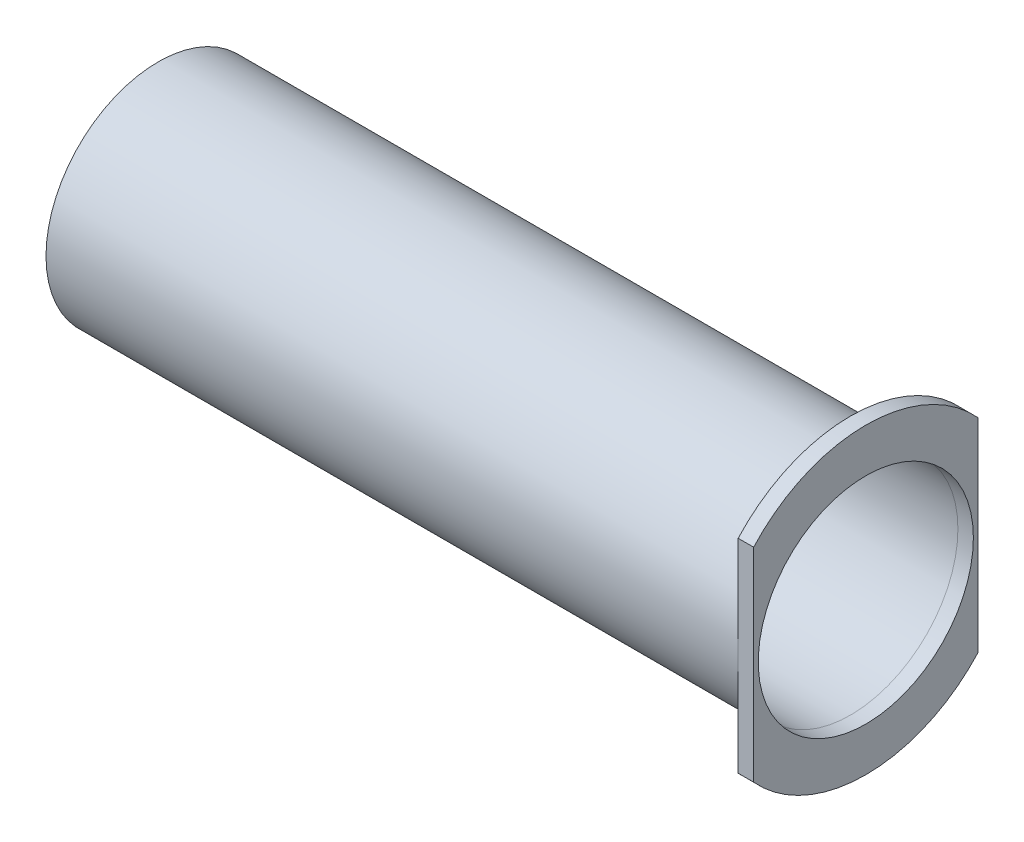
ISO-10303-21;
HEADER;
FILE_DESCRIPTION(('STEP AP214'),'2;1');
FILE_NAME('part.step','',(''),(''),'','','');
FILE_SCHEMA(('AUTOMOTIVE_DESIGN { 1 0 10303 214 1 1 1 1 }'));
ENDSEC;
DATA;
#1=APPLICATION_CONTEXT('core data for automotive mechanical design processes');
#2=APPLICATION_PROTOCOL_DEFINITION('international standard','automotive_design',2000,#1);
#3=PRODUCT_CONTEXT('',#1,'mechanical');
#4=PRODUCT('Part','Part','',(#3));
#5=PRODUCT_RELATED_PRODUCT_CATEGORY('part','',(#4));
#6=PRODUCT_DEFINITION_FORMATION('','',#4);
#7=PRODUCT_DEFINITION_CONTEXT('part definition',#1,'design');
#8=PRODUCT_DEFINITION('design','',#6,#7);
#9=PRODUCT_DEFINITION_SHAPE('','',#8);
#10=(LENGTH_UNIT() NAMED_UNIT(*) SI_UNIT(.MILLI.,.METRE.));
#11=(NAMED_UNIT(*) PLANE_ANGLE_UNIT() SI_UNIT($,.RADIAN.));
#12=(NAMED_UNIT(*) SI_UNIT($,.STERADIAN.) SOLID_ANGLE_UNIT());
#13=UNCERTAINTY_MEASURE_WITH_UNIT(LENGTH_MEASURE(1.E-05),#10,'distance_accuracy_value','');
#14=(GEOMETRIC_REPRESENTATION_CONTEXT(3) GLOBAL_UNCERTAINTY_ASSIGNED_CONTEXT((#13)) GLOBAL_UNIT_ASSIGNED_CONTEXT((#10,
#11,#12)) REPRESENTATION_CONTEXT('',''));
#15=CARTESIAN_POINT('',(0.,0.,0.));
#16=DIRECTION('',(0.,0.,1.));
#17=DIRECTION('',(1.,0.,0.));
#18=AXIS2_PLACEMENT_3D('',#15,#16,#17);
#19=CARTESIAN_POINT('',(79.4552631578947,0.,-24.31));
#20=DIRECTION('',(0.,0.,1.));
#21=DIRECTION('',(1.,0.,0.));
#22=AXIS2_PLACEMENT_3D('',#19,#20,#21);
#23=PLANE('',#22);
#24=DIRECTION('',(0.,1.,0.));
#25=VECTOR('',#24,1.);
#26=CARTESIAN_POINT('',(76.1052631578947,0.,-24.31));
#27=LINE('',#26,#25);
#28=CARTESIAN_POINT('',(76.1052631578947,-22.0494058876878,-24.31));
#29=VERTEX_POINT('',#28);
#30=CARTESIAN_POINT('',(76.1052631578947,22.0494058876878,-24.31));
#31=VERTEX_POINT('',#30);
#32=EDGE_CURVE('E118',#29,#31,#27,.T.);
#33=ORIENTED_EDGE('',*,*,#32,.T.);
#34=DIRECTION('',(-1.,0.,0.));
#35=VECTOR('',#34,1.);
#36=CARTESIAN_POINT('',(79.4552631578947,22.0494058876878,-24.31));
#37=LINE('',#36,#35);
#38=CARTESIAN_POINT('',(79.4552631578947,22.0494058876878,-24.31));
#39=VERTEX_POINT('',#38);
#40=EDGE_CURVE('E12',#39,#31,#37,.T.);
#41=ORIENTED_EDGE('',*,*,#40,.F.);
#42=DIRECTION('',(0.,1.,0.));
#43=VECTOR('',#42,1.);
#44=CARTESIAN_POINT('',(79.4552631578947,0.,-24.31));
#45=LINE('',#44,#43);
#46=CARTESIAN_POINT('',(79.4552631578947,-22.0494058876878,-24.31));
#47=VERTEX_POINT('',#46);
#48=EDGE_CURVE('E100',#47,#39,#45,.T.);
#49=ORIENTED_EDGE('',*,*,#48,.F.);
#50=DIRECTION('',(-1.,0.,0.));
#51=VECTOR('',#50,1.);
#52=CARTESIAN_POINT('',(79.4552631578947,-22.0494058876878,-24.31));
#53=LINE('',#52,#51);
#54=EDGE_CURVE('E117',#47,#29,#53,.T.);
#55=ORIENTED_EDGE('',*,*,#54,.T.);
#56=EDGE_LOOP('',(#33,#41,#49,#55));
#57=FACE_BOUND('',#56,.T.);
#58=ADVANCED_FACE('F52',(#57),#23,.F.);
#59=CARTESIAN_POINT('',(79.4552631578947,0.,0.));
#60=DIRECTION('',(-1.,0.,0.));
#61=DIRECTION('',(0.,0.,1.));
#62=AXIS2_PLACEMENT_3D('',#59,#60,#61);
#63=CYLINDRICAL_SURFACE('',#62,32.82);
#64=CARTESIAN_POINT('',(76.1052631578947,0.,0.));
#65=DIRECTION('',(1.,0.,0.));
#66=DIRECTION('',(0.,0.,-1.));
#67=AXIS2_PLACEMENT_3D('',#64,#65,#66);
#68=CIRCLE('',#67,32.82);
#69=CARTESIAN_POINT('',(76.1052631578947,22.0494058876878,24.31));
#70=VERTEX_POINT('',#69);
#71=EDGE_CURVE('E105',#31,#70,#68,.T.);
#72=ORIENTED_EDGE('',*,*,#71,.T.);
#73=DIRECTION('',(-1.,0.,0.));
#74=VECTOR('',#73,1.);
#75=CARTESIAN_POINT('',(79.4552631578947,22.0494058876878,24.31));
#76=LINE('',#75,#74);
#77=CARTESIAN_POINT('',(79.4552631578947,22.0494058876878,24.31));
#78=VERTEX_POINT('',#77);
#79=EDGE_CURVE('E60',#78,#70,#76,.T.);
#80=ORIENTED_EDGE('',*,*,#79,.F.);
#81=CARTESIAN_POINT('',(79.4552631578947,0.,0.));
#82=DIRECTION('',(1.,0.,0.));
#83=DIRECTION('',(0.,0.,-1.));
#84=AXIS2_PLACEMENT_3D('',#81,#82,#83);
#85=CIRCLE('',#84,32.82);
#86=EDGE_CURVE('E94',#39,#78,#85,.T.);
#87=ORIENTED_EDGE('',*,*,#86,.F.);
#88=ORIENTED_EDGE('',*,*,#40,.T.);
#89=EDGE_LOOP('',(#72,#80,#87,#88));
#90=FACE_BOUND('',#89,.T.);
#91=ADVANCED_FACE('F104',(#90),#63,.T.);
#92=CARTESIAN_POINT('',(79.4552631578947,0.,24.31));
#93=DIRECTION('',(0.,0.,1.));
#94=DIRECTION('',(1.,0.,0.));
#95=AXIS2_PLACEMENT_3D('',#92,#93,#94);
#96=PLANE('',#95);
#97=DIRECTION('',(0.,1.,0.));
#98=VECTOR('',#97,1.);
#99=CARTESIAN_POINT('',(76.1052631578947,0.,24.31));
#100=LINE('',#99,#98);
#101=CARTESIAN_POINT('',(76.1052631578947,-22.0494058876878,24.31));
#102=VERTEX_POINT('',#101);
#103=EDGE_CURVE('E122',#102,#70,#100,.T.);
#104=ORIENTED_EDGE('',*,*,#103,.F.);
#105=DIRECTION('',(-1.,0.,0.));
#106=VECTOR('',#105,1.);
#107=CARTESIAN_POINT('',(79.4552631578947,-22.0494058876878,24.31));
#108=LINE('',#107,#106);
#109=CARTESIAN_POINT('',(79.4552631578947,-22.0494058876878,24.31));
#110=VERTEX_POINT('',#109);
#111=EDGE_CURVE('E84',#110,#102,#108,.T.);
#112=ORIENTED_EDGE('',*,*,#111,.F.);
#113=DIRECTION('',(0.,1.,0.));
#114=VECTOR('',#113,1.);
#115=CARTESIAN_POINT('',(79.4552631578947,0.,24.31));
#116=LINE('',#115,#114);
#117=EDGE_CURVE('E98',#110,#78,#116,.T.);
#118=ORIENTED_EDGE('',*,*,#117,.T.);
#119=ORIENTED_EDGE('',*,*,#79,.T.);
#120=EDGE_LOOP('',(#104,#112,#118,#119));
#121=FACE_BOUND('',#120,.T.);
#122=ADVANCED_FACE('F109',(#121),#96,.T.);
#123=CARTESIAN_POINT('',(79.4552631578947,0.,0.));
#124=DIRECTION('',(-1.,0.,0.));
#125=DIRECTION('',(0.,0.,1.));
#126=AXIS2_PLACEMENT_3D('',#123,#124,#125);
#127=CYLINDRICAL_SURFACE('',#126,32.82);
#128=CARTESIAN_POINT('',(76.1052631578947,0.,0.));
#129=DIRECTION('',(1.,0.,0.));
#130=DIRECTION('',(0.,0.,-1.));
#131=AXIS2_PLACEMENT_3D('',#128,#129,#130);
#132=CIRCLE('',#131,32.82);
#133=EDGE_CURVE('E87',#102,#29,#132,.T.);
#134=ORIENTED_EDGE('',*,*,#133,.T.);
#135=ORIENTED_EDGE('',*,*,#54,.F.);
#136=CARTESIAN_POINT('',(79.4552631578947,0.,0.));
#137=DIRECTION('',(1.,0.,0.));
#138=DIRECTION('',(0.,0.,-1.));
#139=AXIS2_PLACEMENT_3D('',#136,#137,#138);
#140=CIRCLE('',#139,32.82);
#141=EDGE_CURVE('E68',#110,#47,#140,.T.);
#142=ORIENTED_EDGE('',*,*,#141,.F.);
#143=ORIENTED_EDGE('',*,*,#111,.T.);
#144=EDGE_LOOP('',(#134,#135,#142,#143));
#145=FACE_BOUND('',#144,.T.);
#146=ADVANCED_FACE('F140',(#145),#127,.T.);
#147=CARTESIAN_POINT('',(79.4552631578947,0.,0.));
#148=DIRECTION('',(-1.,0.,0.));
#149=DIRECTION('',(0.,0.,1.));
#150=AXIS2_PLACEMENT_3D('',#147,#148,#149);
#151=CYLINDRICAL_SURFACE('',#150,23.31);
#152=CARTESIAN_POINT('',(79.4552631578947,0.,0.));
#153=DIRECTION('',(1.,0.,0.));
#154=DIRECTION('',(0.,0.,-1.));
#155=AXIS2_PLACEMENT_3D('',#152,#153,#154);
#156=CIRCLE('',#155,23.31);
#157=CARTESIAN_POINT('',(79.4552631578947,0.,-23.31));
#158=VERTEX_POINT('',#157);
#159=EDGE_CURVE('E111',#158,#158,#156,.F.);
#160=ORIENTED_EDGE('',*,*,#159,.F.);
#161=EDGE_LOOP('',(#160));
#162=FACE_BOUND('',#161,.T.);
#163=CARTESIAN_POINT('',(76.1052631578947,0.,0.));
#164=DIRECTION('',(1.,0.,0.));
#165=DIRECTION('',(0.,0.,-1.));
#166=AXIS2_PLACEMENT_3D('',#163,#164,#165);
#167=CIRCLE('',#166,23.31);
#168=CARTESIAN_POINT('',(76.1052631578947,0.,-23.31));
#169=VERTEX_POINT('',#168);
#170=EDGE_CURVE('E125',#169,#169,#167,.F.);
#171=ORIENTED_EDGE('',*,*,#170,.T.);
#172=EDGE_LOOP('',(#171));
#173=FACE_BOUND('',#172,.T.);
#174=ADVANCED_FACE('F138',(#162,#173),#151,.F.);
#175=CARTESIAN_POINT('',(79.4552631578947,0.,0.));
#176=DIRECTION('',(1.,0.,0.));
#177=DIRECTION('',(0.,0.,-1.));
#178=AXIS2_PLACEMENT_3D('',#175,#176,#177);
#179=PLANE('',#178);
#180=ORIENTED_EDGE('',*,*,#48,.T.);
#181=ORIENTED_EDGE('',*,*,#86,.T.);
#182=ORIENTED_EDGE('',*,*,#117,.F.);
#183=ORIENTED_EDGE('',*,*,#141,.T.);
#184=EDGE_LOOP('',(#180,#181,#182,#183));
#185=FACE_BOUND('',#184,.T.);
#186=ORIENTED_EDGE('',*,*,#159,.T.);
#187=EDGE_LOOP('',(#186));
#188=FACE_BOUND('',#187,.T.);
#189=ADVANCED_FACE('F95',(#185,#188),#179,.T.);
#190=CARTESIAN_POINT('',(76.1052631578947,0.,0.));
#191=DIRECTION('',(1.,0.,0.));
#192=DIRECTION('',(0.,0.,-1.));
#193=AXIS2_PLACEMENT_3D('',#190,#191,#192);
#194=PLANE('',#193);
#195=ORIENTED_EDGE('',*,*,#32,.F.);
#196=ORIENTED_EDGE('',*,*,#133,.F.);
#197=ORIENTED_EDGE('',*,*,#103,.T.);
#198=ORIENTED_EDGE('',*,*,#71,.F.);
#199=EDGE_LOOP('',(#195,#196,#197,#198));
#200=FACE_BOUND('',#199,.T.);
#201=ORIENTED_EDGE('',*,*,#170,.F.);
#202=EDGE_LOOP('',(#201));
#203=FACE_BOUND('',#202,.T.);
#204=ADVANCED_FACE('F132',(#200,#203),#194,.F.);
#205=CLOSED_SHELL('',(#58,#91,#122,#146,#174,#189,#204));
#206=MANIFOLD_SOLID_BREP('B2',#205);
#207=CARTESIAN_POINT('',(-123.894736842105,0.,0.));
#208=DIRECTION('',(1.,0.,0.));
#209=DIRECTION('',(0.,0.,-1.));
#210=AXIS2_PLACEMENT_3D('',#207,#208,#209);
#211=CYLINDRICAL_SURFACE('',#210,3.825);
#212=CARTESIAN_POINT('',(-78.8947368421053,0.,0.));
#213=DIRECTION('',(1.,0.,0.));
#214=DIRECTION('',(0.,0.,-1.));
#215=AXIS2_PLACEMENT_3D('',#212,#213,#214);
#216=CIRCLE('',#215,3.825);
#217=CARTESIAN_POINT('',(-78.8947368421053,0.,-3.825));
#218=VERTEX_POINT('',#217);
#219=EDGE_CURVE('E255',#218,#218,#216,.F.);
#220=CARTESIAN_POINT('',(-72.8947368421053,0.,0.));
#221=DIRECTION('',(1.,0.,0.));
#222=DIRECTION('',(0.,0.,-1.));
#223=AXIS2_PLACEMENT_3D('',#220,#221,#222);
#224=CIRCLE('',#223,3.825);
#225=CARTESIAN_POINT('',(-72.8947368421053,0.,-3.825));
#226=VERTEX_POINT('',#225);
#227=EDGE_CURVE('E235',#226,#226,#224,.T.);
#228=CARTESIAN_POINT('',(-78.8947368421053,0.,-3.825));
#229=CARTESIAN_POINT('',(-78.8322368421053,0.,-3.825));
#230=CARTESIAN_POINT('',(-78.7697368421053,0.,-3.825));
#231=CARTESIAN_POINT('',(-78.6447368421053,0.,-3.825));
#232=CARTESIAN_POINT('',(-78.5822368421053,0.,-3.825));
#233=CARTESIAN_POINT('',(-78.4572368421053,0.,-3.825));
#234=CARTESIAN_POINT('',(-78.3947368421053,0.,-3.825));
#235=CARTESIAN_POINT('',(-78.2697368421053,0.,-3.825));
#236=CARTESIAN_POINT('',(-78.2072368421053,0.,-3.825));
#237=CARTESIAN_POINT('',(-78.0822368421053,0.,-3.825));
#238=CARTESIAN_POINT('',(-78.0197368421053,0.,-3.825));
#239=CARTESIAN_POINT('',(-77.8947368421053,0.,-3.825));
#240=CARTESIAN_POINT('',(-77.8322368421053,0.,-3.825));
#241=CARTESIAN_POINT('',(-77.7072368421053,0.,-3.825));
#242=CARTESIAN_POINT('',(-77.6447368421053,0.,-3.825));
#243=CARTESIAN_POINT('',(-77.5197368421053,0.,-3.825));
#244=CARTESIAN_POINT('',(-77.4572368421053,0.,-3.825));
#245=CARTESIAN_POINT('',(-77.3322368421053,0.,-3.825));
#246=CARTESIAN_POINT('',(-77.2697368421053,0.,-3.825));
#247=CARTESIAN_POINT('',(-77.1447368421053,0.,-3.825));
#248=CARTESIAN_POINT('',(-77.0822368421053,0.,-3.825));
#249=CARTESIAN_POINT('',(-76.9572368421053,0.,-3.825));
#250=CARTESIAN_POINT('',(-76.8947368421053,0.,-3.825));
#251=CARTESIAN_POINT('',(-76.7697368421053,0.,-3.825));
#252=CARTESIAN_POINT('',(-76.7072368421053,0.,-3.825));
#253=CARTESIAN_POINT('',(-76.5822368421053,0.,-3.825));
#254=CARTESIAN_POINT('',(-76.5197368421053,0.,-3.825));
#255=CARTESIAN_POINT('',(-76.3947368421053,0.,-3.825));
#256=CARTESIAN_POINT('',(-76.3322368421053,0.,-3.825));
#257=CARTESIAN_POINT('',(-76.2072368421053,0.,-3.825));
#258=CARTESIAN_POINT('',(-76.1447368421053,0.,-3.825));
#259=CARTESIAN_POINT('',(-76.0197368421053,0.,-3.825));
#260=CARTESIAN_POINT('',(-75.9572368421053,0.,-3.825));
#261=CARTESIAN_POINT('',(-75.8322368421053,0.,-3.825));
#262=CARTESIAN_POINT('',(-75.7697368421053,0.,-3.825));
#263=CARTESIAN_POINT('',(-75.6447368421053,0.,-3.825));
#264=CARTESIAN_POINT('',(-75.5822368421053,0.,-3.825));
#265=CARTESIAN_POINT('',(-75.4572368421053,0.,-3.825));
#266=CARTESIAN_POINT('',(-75.3947368421053,0.,-3.825));
#267=CARTESIAN_POINT('',(-75.2697368421053,0.,-3.825));
#268=CARTESIAN_POINT('',(-75.2072368421053,0.,-3.825));
#269=CARTESIAN_POINT('',(-75.0822368421053,0.,-3.825));
#270=CARTESIAN_POINT('',(-75.0197368421053,0.,-3.825));
#271=CARTESIAN_POINT('',(-74.8947368421053,0.,-3.825));
#272=CARTESIAN_POINT('',(-74.8322368421053,0.,-3.825));
#273=CARTESIAN_POINT('',(-74.7072368421053,0.,-3.825));
#274=CARTESIAN_POINT('',(-74.6447368421053,0.,-3.825));
#275=CARTESIAN_POINT('',(-74.5197368421053,0.,-3.825));
#276=CARTESIAN_POINT('',(-74.4572368421053,0.,-3.825));
#277=CARTESIAN_POINT('',(-74.3322368421053,0.,-3.825));
#278=CARTESIAN_POINT('',(-74.2697368421053,0.,-3.825));
#279=CARTESIAN_POINT('',(-74.1447368421053,0.,-3.825));
#280=CARTESIAN_POINT('',(-74.0822368421053,0.,-3.825));
#281=CARTESIAN_POINT('',(-73.9572368421053,0.,-3.825));
#282=CARTESIAN_POINT('',(-73.8947368421053,0.,-3.825));
#283=CARTESIAN_POINT('',(-73.7697368421053,0.,-3.825));
#284=CARTESIAN_POINT('',(-73.7072368421053,0.,-3.825));
#285=CARTESIAN_POINT('',(-73.5822368421053,0.,-3.825));
#286=CARTESIAN_POINT('',(-73.5197368421053,0.,-3.825));
#287=CARTESIAN_POINT('',(-73.3947368421053,0.,-3.825));
#288=CARTESIAN_POINT('',(-73.3322368421053,0.,-3.825));
#289=CARTESIAN_POINT('',(-73.2072368421053,0.,-3.825));
#290=CARTESIAN_POINT('',(-73.1447368421053,0.,-3.825));
#291=CARTESIAN_POINT('',(-73.0197368421053,0.,-3.825));
#292=CARTESIAN_POINT('',(-72.9572368421053,0.,-3.825));
#293=CARTESIAN_POINT('',(-72.8947368421053,0.,-3.825));
#294=B_SPLINE_CURVE_WITH_KNOTS('',3,(#228,#229,#230,#231,#232,#233,#234,#235,#236,#237,#238,
#239,#240,#241,#242,#243,#244,#245,#246,#247,#248,#249,#250,#251,#252,#253,#254,#255,#256,#257,
#258,#259,#260,#261,#262,#263,#264,#265,#266,#267,#268,#269,#270,#271,#272,#273,#274,#275,#276,
#277,#278,#279,#280,#281,#282,#283,#284,#285,#286,#287,#288,#289,#290,#291,#292,#293),
.UNSPECIFIED.,.F.,.F.,(4,2,2,2,2,2,2,2,2,2,2,2,2,2,2,2,2,2,2,2,2,2,2,2,2,2,2,2,2,2,2,2,4),(0.,
0.187499999999993,0.374999999999986,0.562499999999994,0.750000000000001,0.937499999999994,
1.12499999999999,1.31249999999999,1.5,1.68749999999999,1.87499999999999,2.06249999999999,2.25,
2.4375,2.62499999999999,2.8125,3.,3.1875,3.37499999999999,3.5625,3.75,3.9375,4.12499999999999,
4.3125,4.5,4.6875,4.87499999999999,5.0625,5.25,5.4375,5.62499999999999,5.8125,6.00000000000001),.UNSPECIFIED.);
#295=EDGE_CURVE('BSEAM231',#218,#226,#294,.T.);
#296=ORIENTED_EDGE('',*,*,#219,.T.);
#297=ORIENTED_EDGE('',*,*,#227,.T.);
#298=ORIENTED_EDGE('',*,*,#295,.T.);
#299=ORIENTED_EDGE('',*,*,#295,.F.);
#300=EDGE_LOOP('',(#296,#298,#297,#299));
#301=FACE_BOUND('',#300,.T.);
#302=ADVANCED_FACE('F231',(#301),#211,.F.);
#303=CARTESIAN_POINT('',(-78.8947368421053,4.825,0.));
#304=DIRECTION('',(1.,0.,0.));
#305=DIRECTION('',(0.,0.,-1.));
#306=AXIS2_PLACEMENT_3D('',#303,#304,#305);
#307=PLANE('',#306);
#308=ORIENTED_EDGE('',*,*,#219,.F.);
#309=EDGE_LOOP('',(#308));
#310=FACE_BOUND('',#309,.T.);
#311=CARTESIAN_POINT('',(-78.8947368421053,0.,0.));
#312=DIRECTION('',(-1.,0.,0.));
#313=DIRECTION('',(0.,0.,1.));
#314=AXIS2_PLACEMENT_3D('',#311,#312,#313);
#315=CIRCLE('',#314,4.825);
#316=CARTESIAN_POINT('',(-78.8947368421053,0.,4.825));
#317=VERTEX_POINT('',#316);
#318=EDGE_CURVE('E51',#317,#317,#315,.T.);
#319=ORIENTED_EDGE('',*,*,#318,.T.);
#320=EDGE_LOOP('',(#319));
#321=FACE_BOUND('',#320,.T.);
#322=ADVANCED_FACE('F233',(#310,#321),#307,.F.);
#323=CARTESIAN_POINT('',(-73.8947368421053,0.,0.));
#324=DIRECTION('',(-1.,0.,0.));
#325=DIRECTION('',(0.,0.,1.));
#326=AXIS2_PLACEMENT_3D('',#323,#324,#325);
#327=CYLINDRICAL_SURFACE('',#326,4.825);
#328=ORIENTED_EDGE('',*,*,#318,.F.);
#329=EDGE_LOOP('',(#328));
#330=FACE_BOUND('',#329,.T.);
#331=CARTESIAN_POINT('',(-73.8947368421053,0.,0.));
#332=DIRECTION('',(-1.,0.,0.));
#333=DIRECTION('',(0.,0.,1.));
#334=AXIS2_PLACEMENT_3D('',#331,#332,#333);
#335=CIRCLE('',#334,4.825);
#336=CARTESIAN_POINT('',(-73.8947368421053,0.,4.825));
#337=VERTEX_POINT('',#336);
#338=EDGE_CURVE('E240',#337,#337,#335,.T.);
#339=ORIENTED_EDGE('',*,*,#338,.T.);
#340=EDGE_LOOP('',(#339));
#341=FACE_BOUND('',#340,.T.);
#342=ADVANCED_FACE('F289',(#330,#341),#327,.T.);
#343=CARTESIAN_POINT('',(-73.8947368421053,24.31,0.));
#344=DIRECTION('',(1.,0.,0.));
#345=DIRECTION('',(0.,0.,-1.));
#346=AXIS2_PLACEMENT_3D('',#343,#344,#345);
#347=PLANE('',#346);
#348=ORIENTED_EDGE('',*,*,#338,.F.);
#349=EDGE_LOOP('',(#348));
#350=FACE_BOUND('',#349,.T.);
#351=CARTESIAN_POINT('',(-73.8947368421053,0.,0.));
#352=DIRECTION('',(-1.,0.,0.));
#353=DIRECTION('',(0.,0.,1.));
#354=AXIS2_PLACEMENT_3D('',#351,#352,#353);
#355=CIRCLE('',#354,24.31);
#356=CARTESIAN_POINT('',(-73.8947368421053,0.,24.31));
#357=VERTEX_POINT('',#356);
#358=EDGE_CURVE('E245',#357,#357,#355,.T.);
#359=ORIENTED_EDGE('',*,*,#358,.T.);
#360=EDGE_LOOP('',(#359));
#361=FACE_BOUND('',#360,.T.);
#362=ADVANCED_FACE('F298',(#350,#361),#347,.F.);
#363=CARTESIAN_POINT('',(-73.8947368421053,0.,0.));
#364=DIRECTION('',(-1.,0.,0.));
#365=DIRECTION('',(0.,0.,1.));
#366=AXIS2_PLACEMENT_3D('',#363,#364,#365);
#367=CYLINDRICAL_SURFACE('',#366,24.31);
#368=ORIENTED_EDGE('',*,*,#358,.F.);
#369=EDGE_LOOP('',(#368));
#370=FACE_BOUND('',#369,.T.);
#371=CARTESIAN_POINT('',(76.1052631578947,0.,0.));
#372=DIRECTION('',(-1.,0.,0.));
#373=DIRECTION('',(0.,0.,1.));
#374=AXIS2_PLACEMENT_3D('',#371,#372,#373);
#375=CIRCLE('',#374,24.31);
#376=CARTESIAN_POINT('',(76.1052631578947,0.,24.31));
#377=VERTEX_POINT('',#376);
#378=EDGE_CURVE('E251',#377,#377,#375,.T.);
#379=ORIENTED_EDGE('',*,*,#378,.T.);
#380=EDGE_LOOP('',(#379));
#381=FACE_BOUND('',#380,.T.);
#382=ADVANCED_FACE('F294',(#370,#381),#367,.T.);
#383=CARTESIAN_POINT('',(76.1052631578947,24.31,0.));
#384=DIRECTION('',(-1.,0.,0.));
#385=DIRECTION('',(0.,0.,1.));
#386=AXIS2_PLACEMENT_3D('',#383,#384,#385);
#387=PLANE('',#386);
#388=CARTESIAN_POINT('',(76.1052631578947,0.,0.));
#389=DIRECTION('',(1.,0.,0.));
#390=DIRECTION('',(0.,0.,-1.));
#391=AXIS2_PLACEMENT_3D('',#388,#389,#390);
#392=CIRCLE('',#391,23.31);
#393=CARTESIAN_POINT('',(76.1052631578947,0.,-23.31));
#394=VERTEX_POINT('',#393);
#395=EDGE_CURVE('E259',#394,#394,#392,.T.);
#396=ORIENTED_EDGE('',*,*,#395,.F.);
#397=EDGE_LOOP('',(#396));
#398=FACE_BOUND('',#397,.T.);
#399=ORIENTED_EDGE('',*,*,#378,.F.);
#400=EDGE_LOOP('',(#399));
#401=FACE_BOUND('',#400,.T.);
#402=ADVANCED_FACE('F280',(#398,#401),#387,.F.);
#403=CARTESIAN_POINT('',(-72.8947368421053,0.,0.));
#404=DIRECTION('',(1.,0.,0.));
#405=DIRECTION('',(0.,0.,-1.));
#406=AXIS2_PLACEMENT_3D('',#403,#404,#405);
#407=CYLINDRICAL_SURFACE('',#406,23.31);
#408=CARTESIAN_POINT('',(-72.8947368421053,0.,0.));
#409=DIRECTION('',(1.,0.,0.));
#410=DIRECTION('',(0.,0.,-1.));
#411=AXIS2_PLACEMENT_3D('',#408,#409,#410);
#412=CIRCLE('',#411,23.31);
#413=CARTESIAN_POINT('',(-72.8947368421053,0.,-23.31));
#414=VERTEX_POINT('',#413);
#415=EDGE_CURVE('E263',#414,#414,#412,.T.);
#416=ORIENTED_EDGE('',*,*,#415,.F.);
#417=EDGE_LOOP('',(#416));
#418=FACE_BOUND('',#417,.T.);
#419=ORIENTED_EDGE('',*,*,#395,.T.);
#420=EDGE_LOOP('',(#419));
#421=FACE_BOUND('',#420,.T.);
#422=ADVANCED_FACE('F275',(#418,#421),#407,.F.);
#423=CARTESIAN_POINT('',(-72.8947368421053,0.,0.));
#424=DIRECTION('',(1.,0.,0.));
#425=DIRECTION('',(0.,0.,-1.));
#426=AXIS2_PLACEMENT_3D('',#423,#424,#425);
#427=PLANE('',#426);
#428=ORIENTED_EDGE('',*,*,#227,.F.);
#429=EDGE_LOOP('',(#428));
#430=FACE_BOUND('',#429,.T.);
#431=ORIENTED_EDGE('',*,*,#415,.T.);
#432=EDGE_LOOP('',(#431));
#433=FACE_BOUND('',#432,.T.);
#434=ADVANCED_FACE('F273',(#430,#433),#427,.T.);
#435=CLOSED_SHELL('',(#302,#322,#342,#362,#382,#402,#422,#434));
#436=MANIFOLD_SOLID_BREP('B6',#435);
#437=ADVANCED_BREP_SHAPE_REPRESENTATION('',(#18,#206,#436),#14);
#438=SHAPE_DEFINITION_REPRESENTATION(#9,#437);
ENDSEC;
END-ISO-10303-21;
